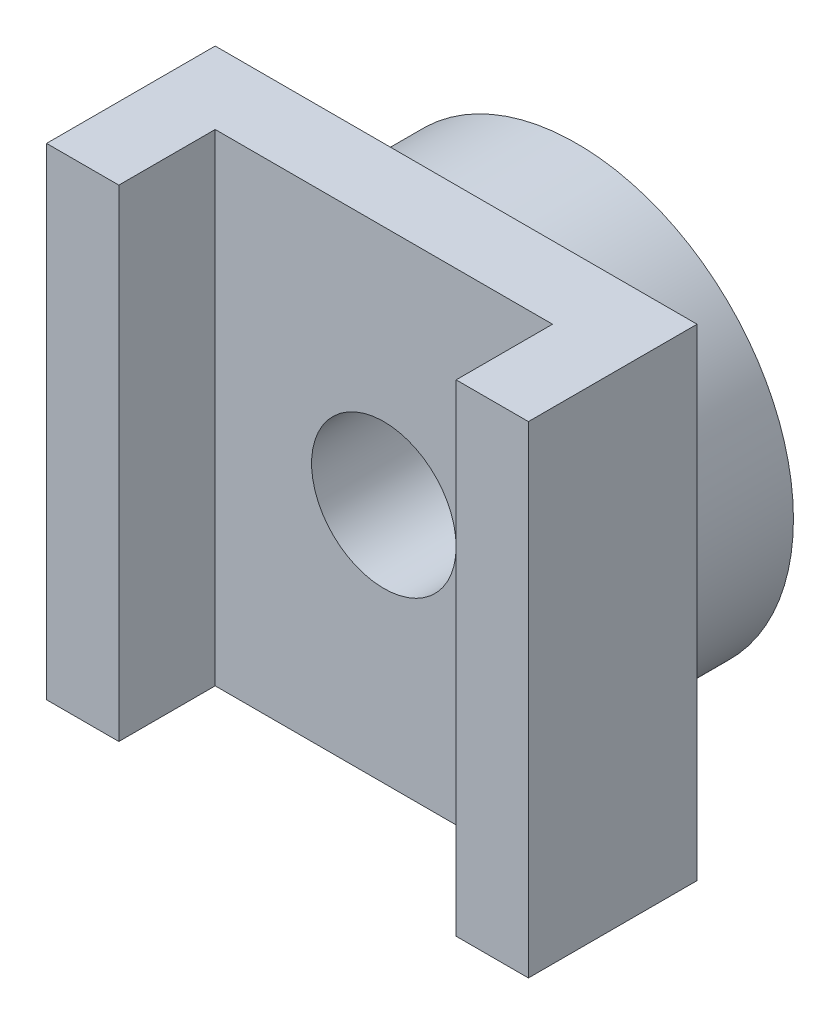
ISO-10303-21;
HEADER;
FILE_DESCRIPTION(('STEP AP214'),'2;1');
FILE_NAME('part.step','',(''),(''),'','','');
FILE_SCHEMA(('AUTOMOTIVE_DESIGN { 1 0 10303 214 1 1 1 1 }'));
ENDSEC;
DATA;
#1=APPLICATION_CONTEXT('core data for automotive mechanical design processes');
#2=APPLICATION_PROTOCOL_DEFINITION('international standard','automotive_design',2000,#1);
#3=PRODUCT_CONTEXT('',#1,'mechanical');
#4=PRODUCT('Part','Part','',(#3));
#5=PRODUCT_RELATED_PRODUCT_CATEGORY('part','',(#4));
#6=PRODUCT_DEFINITION_FORMATION('','',#4);
#7=PRODUCT_DEFINITION_CONTEXT('part definition',#1,'design');
#8=PRODUCT_DEFINITION('design','',#6,#7);
#9=PRODUCT_DEFINITION_SHAPE('','',#8);
#10=(LENGTH_UNIT() NAMED_UNIT(*) SI_UNIT(.MILLI.,.METRE.));
#11=(NAMED_UNIT(*) PLANE_ANGLE_UNIT() SI_UNIT($,.RADIAN.));
#12=(NAMED_UNIT(*) SI_UNIT($,.STERADIAN.) SOLID_ANGLE_UNIT());
#13=UNCERTAINTY_MEASURE_WITH_UNIT(LENGTH_MEASURE(1.E-05),#10,'distance_accuracy_value','');
#14=(GEOMETRIC_REPRESENTATION_CONTEXT(3) GLOBAL_UNCERTAINTY_ASSIGNED_CONTEXT((#13)) GLOBAL_UNIT_ASSIGNED_CONTEXT((#10,
#11,#12)) REPRESENTATION_CONTEXT('',''));
#15=CARTESIAN_POINT('',(0.,0.,0.));
#16=DIRECTION('',(0.,0.,1.));
#17=DIRECTION('',(1.,0.,0.));
#18=AXIS2_PLACEMENT_3D('',#15,#16,#17);
#19=CARTESIAN_POINT('',(0.,0.,4.));
#20=DIRECTION('',(0.,0.,-1.));
#21=DIRECTION('',(-1.,0.,0.));
#22=AXIS2_PLACEMENT_3D('',#19,#20,#21);
#23=PLANE('',#22);
#24=CARTESIAN_POINT('',(0.,0.,4.));
#25=DIRECTION('',(0.,0.,1.));
#26=DIRECTION('',(1.,0.,0.));
#27=AXIS2_PLACEMENT_3D('',#24,#25,#26);
#28=CIRCLE('',#27,1.5);
#29=CARTESIAN_POINT('',(1.5,0.,4.));
#30=VERTEX_POINT('',#29);
#31=EDGE_CURVE('E231',#30,#30,#28,.T.);
#32=ORIENTED_EDGE('',*,*,#31,.F.);
#33=EDGE_LOOP('',(#32));
#34=FACE_BOUND('',#33,.T.);
#35=DIRECTION('',(1.,0.,0.));
#36=VECTOR('',#35,1.);
#37=CARTESIAN_POINT('',(-5.,-5.,4.));
#38=LINE('',#37,#36);
#39=CARTESIAN_POINT('',(-3.5,-5.,4.));
#40=VERTEX_POINT('',#39);
#41=CARTESIAN_POINT('',(3.5,-5.,4.));
#42=VERTEX_POINT('',#41);
#43=EDGE_CURVE('E55',#40,#42,#38,.T.);
#44=ORIENTED_EDGE('',*,*,#43,.T.);
#45=DIRECTION('',(0.,1.,0.));
#46=VECTOR('',#45,1.);
#47=CARTESIAN_POINT('',(3.5,5.,4.));
#48=LINE('',#47,#46);
#49=CARTESIAN_POINT('',(3.5,5.,4.));
#50=VERTEX_POINT('',#49);
#51=EDGE_CURVE('E50',#42,#50,#48,.T.);
#52=ORIENTED_EDGE('',*,*,#51,.T.);
#53=DIRECTION('',(-1.,0.,0.));
#54=VECTOR('',#53,1.);
#55=CARTESIAN_POINT('',(-5.,5.,4.));
#56=LINE('',#55,#54);
#57=CARTESIAN_POINT('',(-3.5,5.,4.));
#58=VERTEX_POINT('',#57);
#59=EDGE_CURVE('E154',#50,#58,#56,.T.);
#60=ORIENTED_EDGE('',*,*,#59,.T.);
#61=DIRECTION('',(0.,1.,0.));
#62=VECTOR('',#61,1.);
#63=CARTESIAN_POINT('',(-3.5,5.,4.));
#64=LINE('',#63,#62);
#65=EDGE_CURVE('E135',#40,#58,#64,.T.);
#66=ORIENTED_EDGE('',*,*,#65,.F.);
#67=EDGE_LOOP('',(#44,#52,#60,#66));
#68=FACE_BOUND('',#67,.T.);
#69=ADVANCED_FACE('F35',(#34,#68),#23,.F.);
#70=CARTESIAN_POINT('',(0.,0.,2.5));
#71=DIRECTION('',(0.,0.,-1.));
#72=DIRECTION('',(-1.,0.,0.));
#73=AXIS2_PLACEMENT_3D('',#70,#71,#72);
#74=CYLINDRICAL_SURFACE('',#73,4.5);
#75=CARTESIAN_POINT('',(0.,0.,2.5));
#76=DIRECTION('',(0.,0.,1.));
#77=DIRECTION('',(1.,0.,0.));
#78=AXIS2_PLACEMENT_3D('',#75,#76,#77);
#79=CIRCLE('',#78,4.5);
#80=CARTESIAN_POINT('',(4.5,0.,2.5));
#81=VERTEX_POINT('',#80);
#82=EDGE_CURVE('E11',#81,#81,#79,.T.);
#83=ORIENTED_EDGE('',*,*,#82,.F.);
#84=EDGE_LOOP('',(#83));
#85=FACE_BOUND('',#84,.T.);
#86=CARTESIAN_POINT('',(0.,0.,0.));
#87=DIRECTION('',(0.,0.,1.));
#88=DIRECTION('',(1.,0.,0.));
#89=AXIS2_PLACEMENT_3D('',#86,#87,#88);
#90=CIRCLE('',#89,4.5);
#91=CARTESIAN_POINT('',(4.5,0.,0.));
#92=VERTEX_POINT('',#91);
#93=EDGE_CURVE('E39',#92,#92,#90,.T.);
#94=ORIENTED_EDGE('',*,*,#93,.T.);
#95=EDGE_LOOP('',(#94));
#96=FACE_BOUND('',#95,.T.);
#97=ADVANCED_FACE('F37',(#85,#96),#74,.T.);
#98=CARTESIAN_POINT('',(0.,0.,0.));
#99=DIRECTION('',(0.,0.,1.));
#100=DIRECTION('',(1.,0.,0.));
#101=AXIS2_PLACEMENT_3D('',#98,#99,#100);
#102=PLANE('',#101);
#103=CARTESIAN_POINT('',(0.,0.,0.));
#104=DIRECTION('',(0.,0.,1.));
#105=DIRECTION('',(1.,0.,0.));
#106=AXIS2_PLACEMENT_3D('',#103,#104,#105);
#107=CIRCLE('',#106,1.5);
#108=CARTESIAN_POINT('',(1.5,0.,0.));
#109=VERTEX_POINT('',#108);
#110=EDGE_CURVE('E132',#109,#109,#107,.T.);
#111=ORIENTED_EDGE('',*,*,#110,.T.);
#112=EDGE_LOOP('',(#111));
#113=FACE_BOUND('',#112,.T.);
#114=ORIENTED_EDGE('',*,*,#93,.F.);
#115=EDGE_LOOP('',(#114));
#116=FACE_BOUND('',#115,.T.);
#117=ADVANCED_FACE('F205',(#113,#116),#102,.F.);
#118=CARTESIAN_POINT('',(5.,-5.,4.));
#119=DIRECTION('',(-1.,0.,0.));
#120=DIRECTION('',(0.,0.,1.));
#121=AXIS2_PLACEMENT_3D('',#118,#119,#120);
#122=PLANE('',#121);
#123=DIRECTION('',(0.,1.,0.));
#124=VECTOR('',#123,1.);
#125=CARTESIAN_POINT('',(5.,-5.,2.5));
#126=LINE('',#125,#124);
#127=CARTESIAN_POINT('',(5.,-5.,2.5));
#128=VERTEX_POINT('',#127);
#129=CARTESIAN_POINT('',(5.,5.,2.5));
#130=VERTEX_POINT('',#129);
#131=EDGE_CURVE('E107',#128,#130,#126,.T.);
#132=ORIENTED_EDGE('',*,*,#131,.T.);
#133=DIRECTION('',(0.,0.,-1.));
#134=VECTOR('',#133,1.);
#135=CARTESIAN_POINT('',(5.,5.,4.));
#136=LINE('',#135,#134);
#137=CARTESIAN_POINT('',(5.,5.,6.));
#138=VERTEX_POINT('',#137);
#139=EDGE_CURVE('E100',#138,#130,#136,.T.);
#140=ORIENTED_EDGE('',*,*,#139,.F.);
#141=DIRECTION('',(0.,-1.,0.));
#142=VECTOR('',#141,1.);
#143=CARTESIAN_POINT('',(5.,5.,6.));
#144=LINE('',#143,#142);
#145=CARTESIAN_POINT('',(5.,-5.,6.));
#146=VERTEX_POINT('',#145);
#147=EDGE_CURVE('E104',#138,#146,#144,.T.);
#148=ORIENTED_EDGE('',*,*,#147,.T.);
#149=DIRECTION('',(0.,0.,-1.));
#150=VECTOR('',#149,1.);
#151=CARTESIAN_POINT('',(5.,-5.,4.));
#152=LINE('',#151,#150);
#153=EDGE_CURVE('E158',#146,#128,#152,.T.);
#154=ORIENTED_EDGE('',*,*,#153,.T.);
#155=EDGE_LOOP('',(#132,#140,#148,#154));
#156=FACE_BOUND('',#155,.T.);
#157=ADVANCED_FACE('F102',(#156),#122,.F.);
#158=CARTESIAN_POINT('',(-5.,5.,4.));
#159=DIRECTION('',(0.,-1.,0.));
#160=DIRECTION('',(0.,0.,-1.));
#161=AXIS2_PLACEMENT_3D('',#158,#159,#160);
#162=PLANE('',#161);
#163=DIRECTION('',(-1.,0.,0.));
#164=VECTOR('',#163,1.);
#165=CARTESIAN_POINT('',(-5.,5.,2.5));
#166=LINE('',#165,#164);
#167=CARTESIAN_POINT('',(-5.,5.,2.5));
#168=VERTEX_POINT('',#167);
#169=EDGE_CURVE('E160',#130,#168,#166,.T.);
#170=ORIENTED_EDGE('',*,*,#169,.T.);
#171=DIRECTION('',(0.,0.,-1.));
#172=VECTOR('',#171,1.);
#173=CARTESIAN_POINT('',(-5.,5.,4.));
#174=LINE('',#173,#172);
#175=CARTESIAN_POINT('',(-5.,5.,6.));
#176=VERTEX_POINT('',#175);
#177=EDGE_CURVE('E110',#176,#168,#174,.T.);
#178=ORIENTED_EDGE('',*,*,#177,.F.);
#179=DIRECTION('',(-1.,0.,0.));
#180=VECTOR('',#179,1.);
#181=CARTESIAN_POINT('',(-5.,5.,6.));
#182=LINE('',#181,#180);
#183=CARTESIAN_POINT('',(-3.5,5.,6.));
#184=VERTEX_POINT('',#183);
#185=EDGE_CURVE('E143',#184,#176,#182,.T.);
#186=ORIENTED_EDGE('',*,*,#185,.F.);
#187=DIRECTION('',(0.,0.,-1.));
#188=VECTOR('',#187,1.);
#189=CARTESIAN_POINT('',(-3.5,5.,6.));
#190=LINE('',#189,#188);
#191=EDGE_CURVE('E146',#184,#58,#190,.T.);
#192=ORIENTED_EDGE('',*,*,#191,.T.);
#193=ORIENTED_EDGE('',*,*,#59,.F.);
#194=DIRECTION('',(0.,0.,-1.));
#195=VECTOR('',#194,1.);
#196=CARTESIAN_POINT('',(3.5,5.,6.));
#197=LINE('',#196,#195);
#198=CARTESIAN_POINT('',(3.5,5.,6.));
#199=VERTEX_POINT('',#198);
#200=EDGE_CURVE('E123',#199,#50,#197,.T.);
#201=ORIENTED_EDGE('',*,*,#200,.F.);
#202=DIRECTION('',(1.,0.,0.));
#203=VECTOR('',#202,1.);
#204=CARTESIAN_POINT('',(5.,5.,6.));
#205=LINE('',#204,#203);
#206=EDGE_CURVE('E116',#199,#138,#205,.T.);
#207=ORIENTED_EDGE('',*,*,#206,.T.);
#208=ORIENTED_EDGE('',*,*,#139,.T.);
#209=EDGE_LOOP('',(#170,#178,#186,#192,#193,#201,#207,#208));
#210=FACE_BOUND('',#209,.T.);
#211=ADVANCED_FACE('F121',(#210),#162,.F.);
#212=CARTESIAN_POINT('',(-5.,-5.,4.));
#213=DIRECTION('',(1.,0.,0.));
#214=DIRECTION('',(0.,0.,-1.));
#215=AXIS2_PLACEMENT_3D('',#212,#213,#214);
#216=PLANE('',#215);
#217=DIRECTION('',(0.,-1.,0.));
#218=VECTOR('',#217,1.);
#219=CARTESIAN_POINT('',(-5.,-5.,2.5));
#220=LINE('',#219,#218);
#221=CARTESIAN_POINT('',(-5.,-5.,2.5));
#222=VERTEX_POINT('',#221);
#223=EDGE_CURVE('E162',#168,#222,#220,.T.);
#224=ORIENTED_EDGE('',*,*,#223,.T.);
#225=DIRECTION('',(0.,0.,-1.));
#226=VECTOR('',#225,1.);
#227=CARTESIAN_POINT('',(-5.,-5.,4.));
#228=LINE('',#227,#226);
#229=CARTESIAN_POINT('',(-5.,-5.,6.));
#230=VERTEX_POINT('',#229);
#231=EDGE_CURVE('E166',#230,#222,#228,.T.);
#232=ORIENTED_EDGE('',*,*,#231,.F.);
#233=DIRECTION('',(0.,-1.,0.));
#234=VECTOR('',#233,1.);
#235=CARTESIAN_POINT('',(-5.,5.,6.));
#236=LINE('',#235,#234);
#237=EDGE_CURVE('E136',#176,#230,#236,.T.);
#238=ORIENTED_EDGE('',*,*,#237,.F.);
#239=ORIENTED_EDGE('',*,*,#177,.T.);
#240=EDGE_LOOP('',(#224,#232,#238,#239));
#241=FACE_BOUND('',#240,.T.);
#242=ADVANCED_FACE('F173',(#241),#216,.F.);
#243=CARTESIAN_POINT('',(-5.,-5.,4.));
#244=DIRECTION('',(0.,1.,0.));
#245=DIRECTION('',(0.,0.,1.));
#246=AXIS2_PLACEMENT_3D('',#243,#244,#245);
#247=PLANE('',#246);
#248=DIRECTION('',(1.,0.,0.));
#249=VECTOR('',#248,1.);
#250=CARTESIAN_POINT('',(-5.,-5.,2.5));
#251=LINE('',#250,#249);
#252=EDGE_CURVE('E156',#222,#128,#251,.T.);
#253=ORIENTED_EDGE('',*,*,#252,.T.);
#254=ORIENTED_EDGE('',*,*,#153,.F.);
#255=DIRECTION('',(-1.,0.,0.));
#256=VECTOR('',#255,1.);
#257=CARTESIAN_POINT('',(5.,-5.,6.));
#258=LINE('',#257,#256);
#259=CARTESIAN_POINT('',(3.5,-5.,6.));
#260=VERTEX_POINT('',#259);
#261=EDGE_CURVE('E119',#146,#260,#258,.T.);
#262=ORIENTED_EDGE('',*,*,#261,.T.);
#263=DIRECTION('',(0.,0.,-1.));
#264=VECTOR('',#263,1.);
#265=CARTESIAN_POINT('',(3.5,-5.,6.));
#266=LINE('',#265,#264);
#267=EDGE_CURVE('E130',#260,#42,#266,.T.);
#268=ORIENTED_EDGE('',*,*,#267,.T.);
#269=ORIENTED_EDGE('',*,*,#43,.F.);
#270=DIRECTION('',(0.,0.,-1.));
#271=VECTOR('',#270,1.);
#272=CARTESIAN_POINT('',(-3.5,-5.,6.));
#273=LINE('',#272,#271);
#274=CARTESIAN_POINT('',(-3.5,-5.,6.));
#275=VERTEX_POINT('',#274);
#276=EDGE_CURVE('E151',#275,#40,#273,.T.);
#277=ORIENTED_EDGE('',*,*,#276,.F.);
#278=DIRECTION('',(1.,0.,0.));
#279=VECTOR('',#278,1.);
#280=CARTESIAN_POINT('',(-5.,-5.,6.));
#281=LINE('',#280,#279);
#282=EDGE_CURVE('E139',#230,#275,#281,.T.);
#283=ORIENTED_EDGE('',*,*,#282,.F.);
#284=ORIENTED_EDGE('',*,*,#231,.T.);
#285=EDGE_LOOP('',(#253,#254,#262,#268,#269,#277,#283,#284));
#286=FACE_BOUND('',#285,.T.);
#287=ADVANCED_FACE('F179',(#286),#247,.F.);
#288=CARTESIAN_POINT('',(0.,0.,2.5));
#289=DIRECTION('',(0.,0.,-1.));
#290=DIRECTION('',(-1.,0.,0.));
#291=AXIS2_PLACEMENT_3D('',#288,#289,#290);
#292=PLANE('',#291);
#293=ORIENTED_EDGE('',*,*,#82,.T.);
#294=EDGE_LOOP('',(#293));
#295=FACE_BOUND('',#294,.T.);
#296=ORIENTED_EDGE('',*,*,#131,.F.);
#297=ORIENTED_EDGE('',*,*,#252,.F.);
#298=ORIENTED_EDGE('',*,*,#223,.F.);
#299=ORIENTED_EDGE('',*,*,#169,.F.);
#300=EDGE_LOOP('',(#296,#297,#298,#299));
#301=FACE_BOUND('',#300,.T.);
#302=ADVANCED_FACE('F177',(#295,#301),#292,.T.);
#303=CARTESIAN_POINT('',(-3.5,5.,6.));
#304=DIRECTION('',(-1.,0.,0.));
#305=DIRECTION('',(0.,-1.,0.));
#306=AXIS2_PLACEMENT_3D('',#303,#304,#305);
#307=PLANE('',#306);
#308=ORIENTED_EDGE('',*,*,#65,.T.);
#309=ORIENTED_EDGE('',*,*,#191,.F.);
#310=DIRECTION('',(0.,1.,0.));
#311=VECTOR('',#310,1.);
#312=CARTESIAN_POINT('',(-3.5,5.,6.));
#313=LINE('',#312,#311);
#314=EDGE_CURVE('E141',#275,#184,#313,.T.);
#315=ORIENTED_EDGE('',*,*,#314,.F.);
#316=ORIENTED_EDGE('',*,*,#276,.T.);
#317=EDGE_LOOP('',(#308,#309,#315,#316));
#318=FACE_BOUND('',#317,.T.);
#319=ADVANCED_FACE('F187',(#318),#307,.F.);
#320=CARTESIAN_POINT('',(0.,0.,6.));
#321=DIRECTION('',(0.,0.,1.));
#322=DIRECTION('',(1.,0.,0.));
#323=AXIS2_PLACEMENT_3D('',#320,#321,#322);
#324=PLANE('',#323);
#325=ORIENTED_EDGE('',*,*,#237,.T.);
#326=ORIENTED_EDGE('',*,*,#282,.T.);
#327=ORIENTED_EDGE('',*,*,#314,.T.);
#328=ORIENTED_EDGE('',*,*,#185,.T.);
#329=EDGE_LOOP('',(#325,#326,#327,#328));
#330=FACE_BOUND('',#329,.T.);
#331=ADVANCED_FACE('F184',(#330),#324,.T.);
#332=CARTESIAN_POINT('',(3.5,5.,6.));
#333=DIRECTION('',(-1.,0.,0.));
#334=DIRECTION('',(0.,-1.,0.));
#335=AXIS2_PLACEMENT_3D('',#332,#333,#334);
#336=PLANE('',#335);
#337=ORIENTED_EDGE('',*,*,#51,.F.);
#338=ORIENTED_EDGE('',*,*,#267,.F.);
#339=DIRECTION('',(0.,1.,0.));
#340=VECTOR('',#339,1.);
#341=CARTESIAN_POINT('',(3.5,5.,6.));
#342=LINE('',#341,#340);
#343=EDGE_CURVE('E124',#260,#199,#342,.T.);
#344=ORIENTED_EDGE('',*,*,#343,.T.);
#345=ORIENTED_EDGE('',*,*,#200,.T.);
#346=EDGE_LOOP('',(#337,#338,#344,#345));
#347=FACE_BOUND('',#346,.T.);
#348=ADVANCED_FACE('F189',(#347),#336,.T.);
#349=CARTESIAN_POINT('',(0.,0.,6.));
#350=DIRECTION('',(0.,0.,1.));
#351=DIRECTION('',(-1.,0.,0.));
#352=AXIS2_PLACEMENT_3D('',#349,#350,#351);
#353=PLANE('',#352);
#354=ORIENTED_EDGE('',*,*,#147,.F.);
#355=ORIENTED_EDGE('',*,*,#206,.F.);
#356=ORIENTED_EDGE('',*,*,#343,.F.);
#357=ORIENTED_EDGE('',*,*,#261,.F.);
#358=EDGE_LOOP('',(#354,#355,#356,#357));
#359=FACE_BOUND('',#358,.T.);
#360=ADVANCED_FACE('F114',(#359),#353,.T.);
#361=CARTESIAN_POINT('',(0.,0.,4.));
#362=DIRECTION('',(0.,0.,1.));
#363=DIRECTION('',(1.,0.,0.));
#364=AXIS2_PLACEMENT_3D('',#361,#362,#363);
#365=CYLINDRICAL_SURFACE('',#364,1.5);
#366=ORIENTED_EDGE('',*,*,#110,.F.);
#367=EDGE_LOOP('',(#366));
#368=FACE_BOUND('',#367,.T.);
#369=ORIENTED_EDGE('',*,*,#31,.T.);
#370=EDGE_LOOP('',(#369));
#371=FACE_BOUND('',#370,.T.);
#372=ADVANCED_FACE('F196',(#368,#371),#365,.F.);
#373=CLOSED_SHELL('',(#69,#97,#117,#157,#211,#242,#287,#302,#319,#331,#348,#360,#372));
#374=MANIFOLD_SOLID_BREP('B2',#373);
#375=ADVANCED_BREP_SHAPE_REPRESENTATION('',(#18,#374),#14);
#376=SHAPE_DEFINITION_REPRESENTATION(#9,#375);
ENDSEC;
END-ISO-10303-21;
